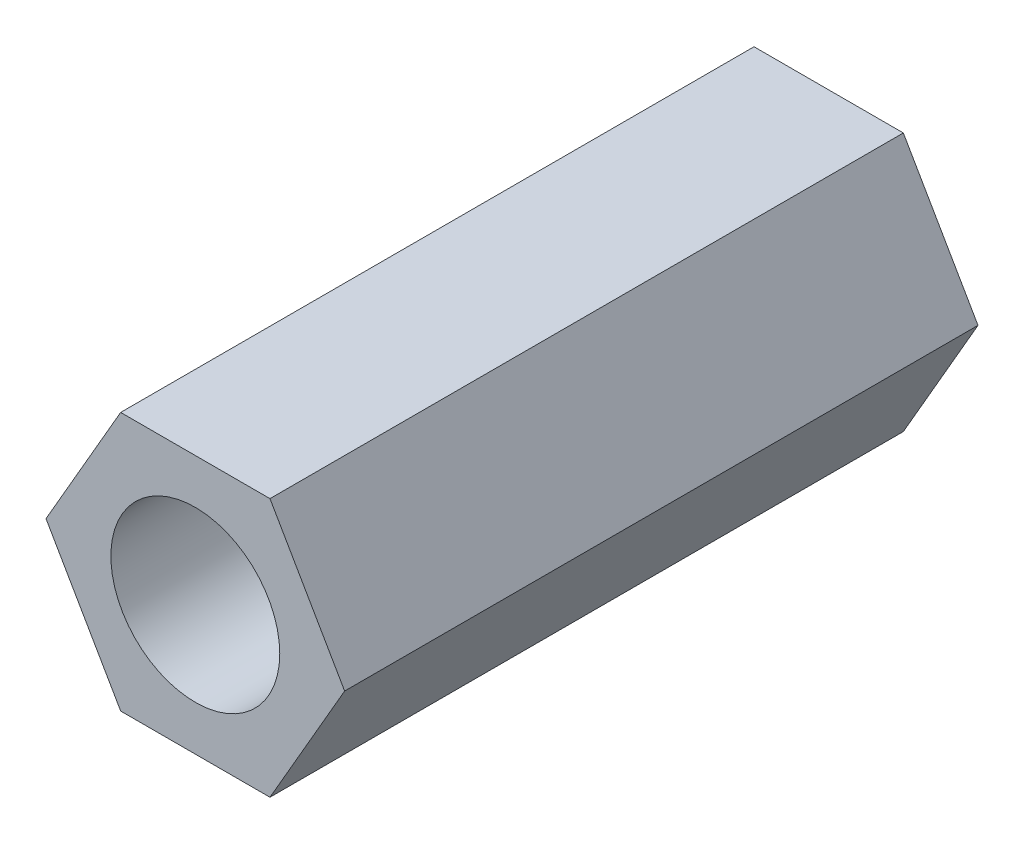
ISO-10303-21;
HEADER;
FILE_DESCRIPTION(('STEP AP214'),'2;1');
FILE_NAME('part.step','',(''),(''),'','','');
FILE_SCHEMA(('AUTOMOTIVE_DESIGN { 1 0 10303 214 1 1 1 1 }'));
ENDSEC;
DATA;
#1=APPLICATION_CONTEXT('core data for automotive mechanical design processes');
#2=APPLICATION_PROTOCOL_DEFINITION('international standard','automotive_design',2000,#1);
#3=PRODUCT_CONTEXT('',#1,'mechanical');
#4=PRODUCT('Part','Part','',(#3));
#5=PRODUCT_RELATED_PRODUCT_CATEGORY('part','',(#4));
#6=PRODUCT_DEFINITION_FORMATION('','',#4);
#7=PRODUCT_DEFINITION_CONTEXT('part definition',#1,'design');
#8=PRODUCT_DEFINITION('design','',#6,#7);
#9=PRODUCT_DEFINITION_SHAPE('','',#8);
#10=(LENGTH_UNIT() NAMED_UNIT(*) SI_UNIT(.MILLI.,.METRE.));
#11=(NAMED_UNIT(*) PLANE_ANGLE_UNIT() SI_UNIT($,.RADIAN.));
#12=(NAMED_UNIT(*) SI_UNIT($,.STERADIAN.) SOLID_ANGLE_UNIT());
#13=UNCERTAINTY_MEASURE_WITH_UNIT(LENGTH_MEASURE(1.E-05),#10,'distance_accuracy_value','');
#14=(GEOMETRIC_REPRESENTATION_CONTEXT(3) GLOBAL_UNCERTAINTY_ASSIGNED_CONTEXT((#13)) GLOBAL_UNIT_ASSIGNED_CONTEXT((#10,
#11,#12)) REPRESENTATION_CONTEXT('',''));
#15=CARTESIAN_POINT('',(0.,0.,0.));
#16=DIRECTION('',(0.,0.,1.));
#17=DIRECTION('',(1.,0.,0.));
#18=AXIS2_PLACEMENT_3D('',#15,#16,#17);
#19=CARTESIAN_POINT('',(0.,0.,12.));
#20=DIRECTION('',(0.,0.,1.));
#21=DIRECTION('',(1.,0.,0.));
#22=AXIS2_PLACEMENT_3D('',#19,#20,#21);
#23=PLANE('',#22);
#24=DIRECTION('',(0.5,0.866025403784439,0.));
#25=VECTOR('',#24,1.);
#26=CARTESIAN_POINT('',(1.41450815951458,-2.45,12.));
#27=LINE('',#26,#25);
#28=CARTESIAN_POINT('',(1.41450815951458,-2.45,12.));
#29=VERTEX_POINT('',#28);
#30=CARTESIAN_POINT('',(2.82901631902917,0.,12.));
#31=VERTEX_POINT('',#30);
#32=EDGE_CURVE('E146',#29,#31,#27,.T.);
#33=ORIENTED_EDGE('',*,*,#32,.T.);
#34=DIRECTION('',(-0.5,0.866025403784439,0.));
#35=VECTOR('',#34,1.);
#36=CARTESIAN_POINT('',(2.82901631902917,0.,12.));
#37=LINE('',#36,#35);
#38=CARTESIAN_POINT('',(1.41450815951458,2.45,12.));
#39=VERTEX_POINT('',#38);
#40=EDGE_CURVE('E94',#31,#39,#37,.T.);
#41=ORIENTED_EDGE('',*,*,#40,.T.);
#42=DIRECTION('',(-1.,0.,0.));
#43=VECTOR('',#42,1.);
#44=CARTESIAN_POINT('',(1.41450815951458,2.45,12.));
#45=LINE('',#44,#43);
#46=CARTESIAN_POINT('',(-1.41450815951458,2.45,12.));
#47=VERTEX_POINT('',#46);
#48=EDGE_CURVE('E107',#39,#47,#45,.T.);
#49=ORIENTED_EDGE('',*,*,#48,.T.);
#50=DIRECTION('',(-0.5,-0.866025403784439,0.));
#51=VECTOR('',#50,1.);
#52=CARTESIAN_POINT('',(-1.41450815951458,2.45,12.));
#53=LINE('',#52,#51);
#54=CARTESIAN_POINT('',(-2.82901631902917,0.,12.));
#55=VERTEX_POINT('',#54);
#56=EDGE_CURVE('E101',#47,#55,#53,.T.);
#57=ORIENTED_EDGE('',*,*,#56,.T.);
#58=DIRECTION('',(0.5,-0.866025403784439,0.));
#59=VECTOR('',#58,1.);
#60=CARTESIAN_POINT('',(-2.82901631902917,0.,12.));
#61=LINE('',#60,#59);
#62=CARTESIAN_POINT('',(-1.41450815951458,-2.45,12.));
#63=VERTEX_POINT('',#62);
#64=EDGE_CURVE('E105',#55,#63,#61,.T.);
#65=ORIENTED_EDGE('',*,*,#64,.T.);
#66=DIRECTION('',(1.,0.,0.));
#67=VECTOR('',#66,1.);
#68=CARTESIAN_POINT('',(-1.41450815951458,-2.45,12.));
#69=LINE('',#68,#67);
#70=EDGE_CURVE('E57',#63,#29,#69,.T.);
#71=ORIENTED_EDGE('',*,*,#70,.T.);
#72=EDGE_LOOP('',(#33,#41,#49,#57,#65,#71));
#73=FACE_BOUND('',#72,.T.);
#74=CARTESIAN_POINT('',(0.,0.,12.));
#75=DIRECTION('',(0.,0.,1.));
#76=DIRECTION('',(1.,0.,0.));
#77=AXIS2_PLACEMENT_3D('',#74,#75,#76);
#78=CIRCLE('',#77,1.6);
#79=CARTESIAN_POINT('',(1.6,0.,12.));
#80=VERTEX_POINT('',#79);
#81=EDGE_CURVE('E134',#80,#80,#78,.T.);
#82=ORIENTED_EDGE('',*,*,#81,.F.);
#83=EDGE_LOOP('',(#82));
#84=FACE_BOUND('',#83,.T.);
#85=ADVANCED_FACE('F39',(#73,#84),#23,.T.);
#86=CARTESIAN_POINT('',(0.,0.,0.));
#87=DIRECTION('',(0.,0.,1.));
#88=DIRECTION('',(1.,0.,0.));
#89=AXIS2_PLACEMENT_3D('',#86,#87,#88);
#90=PLANE('',#89);
#91=DIRECTION('',(0.5,0.866025403784439,0.));
#92=VECTOR('',#91,1.);
#93=CARTESIAN_POINT('',(1.41450815951458,-2.45,0.));
#94=LINE('',#93,#92);
#95=CARTESIAN_POINT('',(1.41450815951458,-2.45,0.));
#96=VERTEX_POINT('',#95);
#97=CARTESIAN_POINT('',(2.82901631902917,0.,0.));
#98=VERTEX_POINT('',#97);
#99=EDGE_CURVE('E129',#96,#98,#94,.T.);
#100=ORIENTED_EDGE('',*,*,#99,.F.);
#101=DIRECTION('',(1.,0.,0.));
#102=VECTOR('',#101,1.);
#103=CARTESIAN_POINT('',(-1.41450815951458,-2.45,0.));
#104=LINE('',#103,#102);
#105=CARTESIAN_POINT('',(-1.41450815951458,-2.45,0.));
#106=VERTEX_POINT('',#105);
#107=EDGE_CURVE('E86',#106,#96,#104,.T.);
#108=ORIENTED_EDGE('',*,*,#107,.F.);
#109=DIRECTION('',(0.5,-0.866025403784439,0.));
#110=VECTOR('',#109,1.);
#111=CARTESIAN_POINT('',(-2.82901631902917,0.,0.));
#112=LINE('',#111,#110);
#113=CARTESIAN_POINT('',(-2.82901631902917,0.,0.));
#114=VERTEX_POINT('',#113);
#115=EDGE_CURVE('E80',#114,#106,#112,.T.);
#116=ORIENTED_EDGE('',*,*,#115,.F.);
#117=DIRECTION('',(-0.5,-0.866025403784439,0.));
#118=VECTOR('',#117,1.);
#119=CARTESIAN_POINT('',(-1.41450815951458,2.45,0.));
#120=LINE('',#119,#118);
#121=CARTESIAN_POINT('',(-1.41450815951458,2.45,0.));
#122=VERTEX_POINT('',#121);
#123=EDGE_CURVE('E116',#122,#114,#120,.T.);
#124=ORIENTED_EDGE('',*,*,#123,.F.);
#125=DIRECTION('',(-1.,0.,0.));
#126=VECTOR('',#125,1.);
#127=CARTESIAN_POINT('',(1.41450815951458,2.45,0.));
#128=LINE('',#127,#126);
#129=CARTESIAN_POINT('',(1.41450815951458,2.45,0.));
#130=VERTEX_POINT('',#129);
#131=EDGE_CURVE('E137',#130,#122,#128,.T.);
#132=ORIENTED_EDGE('',*,*,#131,.F.);
#133=DIRECTION('',(-0.5,0.866025403784439,0.));
#134=VECTOR('',#133,1.);
#135=CARTESIAN_POINT('',(2.82901631902917,0.,0.));
#136=LINE('',#135,#134);
#137=EDGE_CURVE('E133',#98,#130,#136,.T.);
#138=ORIENTED_EDGE('',*,*,#137,.F.);
#139=EDGE_LOOP('',(#100,#108,#116,#124,#132,#138));
#140=FACE_BOUND('',#139,.T.);
#141=CARTESIAN_POINT('',(0.,0.,0.));
#142=DIRECTION('',(0.,0.,1.));
#143=DIRECTION('',(1.,0.,0.));
#144=AXIS2_PLACEMENT_3D('',#141,#142,#143);
#145=CIRCLE('',#144,1.6);
#146=CARTESIAN_POINT('',(1.6,0.,0.));
#147=VERTEX_POINT('',#146);
#148=EDGE_CURVE('E243',#147,#147,#145,.T.);
#149=ORIENTED_EDGE('',*,*,#148,.T.);
#150=EDGE_LOOP('',(#149));
#151=FACE_BOUND('',#150,.T.);
#152=ADVANCED_FACE('F159',(#140,#151),#90,.F.);
#153=CARTESIAN_POINT('',(1.41450815951458,-2.45,12.));
#154=DIRECTION('',(-0.866025403784439,0.5,0.));
#155=DIRECTION('',(-0.5,-0.866025403784439,0.));
#156=AXIS2_PLACEMENT_3D('',#153,#154,#155);
#157=PLANE('',#156);
#158=ORIENTED_EDGE('',*,*,#99,.T.);
#159=DIRECTION('',(0.,0.,-1.));
#160=VECTOR('',#159,1.);
#161=CARTESIAN_POINT('',(2.82901631902917,0.,12.));
#162=LINE('',#161,#160);
#163=EDGE_CURVE('E11',#31,#98,#162,.T.);
#164=ORIENTED_EDGE('',*,*,#163,.F.);
#165=ORIENTED_EDGE('',*,*,#32,.F.);
#166=DIRECTION('',(0.,0.,-1.));
#167=VECTOR('',#166,1.);
#168=CARTESIAN_POINT('',(1.41450815951458,-2.45,12.));
#169=LINE('',#168,#167);
#170=EDGE_CURVE('E125',#29,#96,#169,.T.);
#171=ORIENTED_EDGE('',*,*,#170,.T.);
#172=EDGE_LOOP('',(#158,#164,#165,#171));
#173=FACE_BOUND('',#172,.T.);
#174=ADVANCED_FACE('F41',(#173),#157,.F.);
#175=CARTESIAN_POINT('',(2.82901631902917,0.,12.));
#176=DIRECTION('',(-0.866025403784438,-0.5,0.));
#177=DIRECTION('',(0.5,-0.866025403784439,0.));
#178=AXIS2_PLACEMENT_3D('',#175,#176,#177);
#179=PLANE('',#178);
#180=ORIENTED_EDGE('',*,*,#137,.T.);
#181=DIRECTION('',(0.,0.,-1.));
#182=VECTOR('',#181,1.);
#183=CARTESIAN_POINT('',(1.41450815951458,2.45,12.));
#184=LINE('',#183,#182);
#185=EDGE_CURVE('E49',#39,#130,#184,.T.);
#186=ORIENTED_EDGE('',*,*,#185,.F.);
#187=ORIENTED_EDGE('',*,*,#40,.F.);
#188=ORIENTED_EDGE('',*,*,#163,.T.);
#189=EDGE_LOOP('',(#180,#186,#187,#188));
#190=FACE_BOUND('',#189,.T.);
#191=ADVANCED_FACE('F184',(#190),#179,.F.);
#192=CARTESIAN_POINT('',(1.41450815951458,2.45,12.));
#193=DIRECTION('',(0.,-1.,0.));
#194=DIRECTION('',(0.,0.,-1.));
#195=AXIS2_PLACEMENT_3D('',#192,#193,#194);
#196=PLANE('',#195);
#197=ORIENTED_EDGE('',*,*,#131,.T.);
#198=DIRECTION('',(0.,0.,-1.));
#199=VECTOR('',#198,1.);
#200=CARTESIAN_POINT('',(-1.41450815951458,2.45,12.));
#201=LINE('',#200,#199);
#202=EDGE_CURVE('E118',#47,#122,#201,.T.);
#203=ORIENTED_EDGE('',*,*,#202,.F.);
#204=ORIENTED_EDGE('',*,*,#48,.F.);
#205=ORIENTED_EDGE('',*,*,#185,.T.);
#206=EDGE_LOOP('',(#197,#203,#204,#205));
#207=FACE_BOUND('',#206,.T.);
#208=ADVANCED_FACE('F156',(#207),#196,.F.);
#209=CARTESIAN_POINT('',(-1.41450815951458,2.45,12.));
#210=DIRECTION('',(0.866025403784439,-0.5,0.));
#211=DIRECTION('',(0.5,0.866025403784439,0.));
#212=AXIS2_PLACEMENT_3D('',#209,#210,#211);
#213=PLANE('',#212);
#214=ORIENTED_EDGE('',*,*,#123,.T.);
#215=DIRECTION('',(0.,0.,-1.));
#216=VECTOR('',#215,1.);
#217=CARTESIAN_POINT('',(-2.82901631902917,0.,12.));
#218=LINE('',#217,#216);
#219=EDGE_CURVE('E113',#55,#114,#218,.T.);
#220=ORIENTED_EDGE('',*,*,#219,.F.);
#221=ORIENTED_EDGE('',*,*,#56,.F.);
#222=ORIENTED_EDGE('',*,*,#202,.T.);
#223=EDGE_LOOP('',(#214,#220,#221,#222));
#224=FACE_BOUND('',#223,.T.);
#225=ADVANCED_FACE('F114',(#224),#213,.F.);
#226=CARTESIAN_POINT('',(-2.82901631902917,0.,12.));
#227=DIRECTION('',(0.866025403784438,0.5,0.));
#228=DIRECTION('',(-0.5,0.866025403784439,0.));
#229=AXIS2_PLACEMENT_3D('',#226,#227,#228);
#230=PLANE('',#229);
#231=ORIENTED_EDGE('',*,*,#115,.T.);
#232=DIRECTION('',(0.,0.,-1.));
#233=VECTOR('',#232,1.);
#234=CARTESIAN_POINT('',(-1.41450815951458,-2.45,12.));
#235=LINE('',#234,#233);
#236=EDGE_CURVE('E119',#63,#106,#235,.T.);
#237=ORIENTED_EDGE('',*,*,#236,.F.);
#238=ORIENTED_EDGE('',*,*,#64,.F.);
#239=ORIENTED_EDGE('',*,*,#219,.T.);
#240=EDGE_LOOP('',(#231,#237,#238,#239));
#241=FACE_BOUND('',#240,.T.);
#242=ADVANCED_FACE('F121',(#241),#230,.F.);
#243=CARTESIAN_POINT('',(-1.41450815951458,-2.45,12.));
#244=DIRECTION('',(0.,1.,0.));
#245=DIRECTION('',(0.,0.,1.));
#246=AXIS2_PLACEMENT_3D('',#243,#244,#245);
#247=PLANE('',#246);
#248=ORIENTED_EDGE('',*,*,#107,.T.);
#249=ORIENTED_EDGE('',*,*,#170,.F.);
#250=ORIENTED_EDGE('',*,*,#70,.F.);
#251=ORIENTED_EDGE('',*,*,#236,.T.);
#252=EDGE_LOOP('',(#248,#249,#250,#251));
#253=FACE_BOUND('',#252,.T.);
#254=ADVANCED_FACE('F164',(#253),#247,.F.);
#255=CARTESIAN_POINT('',(0.,0.,12.));
#256=DIRECTION('',(0.,0.,-1.));
#257=DIRECTION('',(-1.,0.,0.));
#258=AXIS2_PLACEMENT_3D('',#255,#256,#257);
#259=CYLINDRICAL_SURFACE('',#258,1.6);
#260=ORIENTED_EDGE('',*,*,#81,.T.);
#261=EDGE_LOOP('',(#260));
#262=FACE_BOUND('',#261,.T.);
#263=ORIENTED_EDGE('',*,*,#148,.F.);
#264=EDGE_LOOP('',(#263));
#265=FACE_BOUND('',#264,.T.);
#266=ADVANCED_FACE('F166',(#262,#265),#259,.F.);
#267=CLOSED_SHELL('',(#85,#152,#174,#191,#208,#225,#242,#254,#266));
#268=MANIFOLD_SOLID_BREP('B2',#267);
#269=ADVANCED_BREP_SHAPE_REPRESENTATION('',(#18,#268),#14);
#270=SHAPE_DEFINITION_REPRESENTATION(#9,#269);
ENDSEC;
END-ISO-10303-21;
